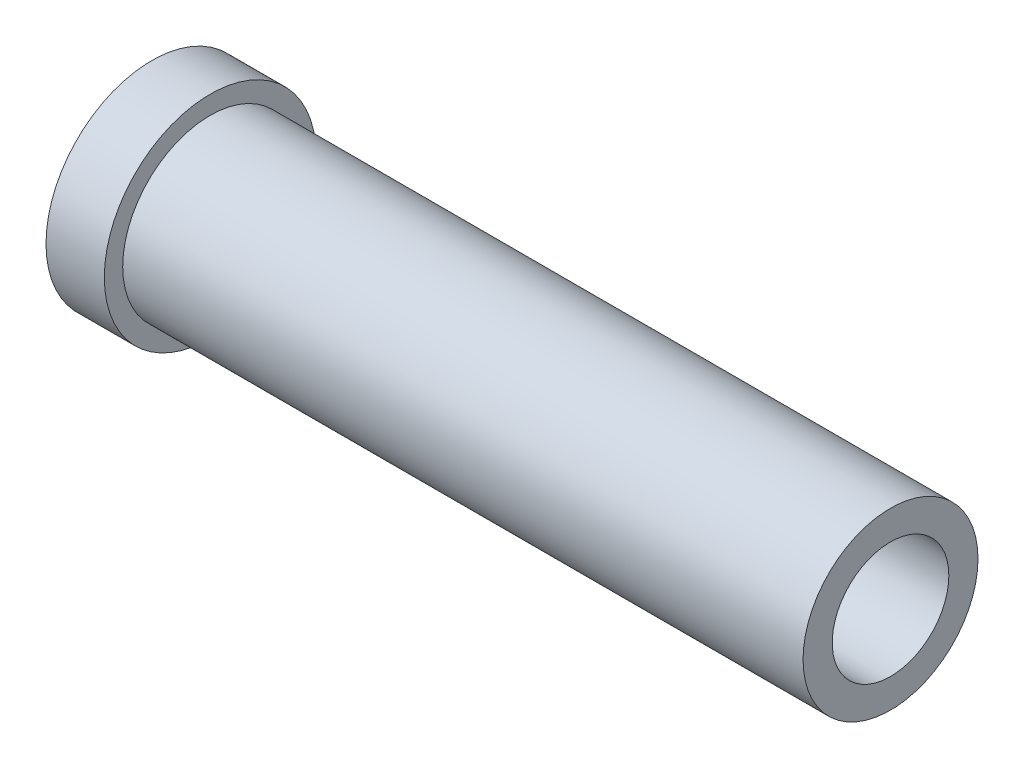
ISO-10303-21;
HEADER;
FILE_DESCRIPTION(('STEP AP214'),'2;1');
FILE_NAME('part.step','',(''),(''),'','','');
FILE_SCHEMA(('AUTOMOTIVE_DESIGN { 1 0 10303 214 1 1 1 1 }'));
ENDSEC;
DATA;
#1=APPLICATION_CONTEXT('core data for automotive mechanical design processes');
#2=APPLICATION_PROTOCOL_DEFINITION('international standard','automotive_design',2000,#1);
#3=PRODUCT_CONTEXT('',#1,'mechanical');
#4=PRODUCT('Part','Part','',(#3));
#5=PRODUCT_RELATED_PRODUCT_CATEGORY('part','',(#4));
#6=PRODUCT_DEFINITION_FORMATION('','',#4);
#7=PRODUCT_DEFINITION_CONTEXT('part definition',#1,'design');
#8=PRODUCT_DEFINITION('design','',#6,#7);
#9=PRODUCT_DEFINITION_SHAPE('','',#8);
#10=(LENGTH_UNIT() NAMED_UNIT(*) SI_UNIT(.MILLI.,.METRE.));
#11=(NAMED_UNIT(*) PLANE_ANGLE_UNIT() SI_UNIT($,.RADIAN.));
#12=(NAMED_UNIT(*) SI_UNIT($,.STERADIAN.) SOLID_ANGLE_UNIT());
#13=UNCERTAINTY_MEASURE_WITH_UNIT(LENGTH_MEASURE(1.E-05),#10,'distance_accuracy_value','');
#14=(GEOMETRIC_REPRESENTATION_CONTEXT(3) GLOBAL_UNCERTAINTY_ASSIGNED_CONTEXT((#13)) GLOBAL_UNIT_ASSIGNED_CONTEXT((#10,
#11,#12)) REPRESENTATION_CONTEXT('',''));
#15=CARTESIAN_POINT('',(0.,0.,0.));
#16=DIRECTION('',(0.,0.,1.));
#17=DIRECTION('',(1.,0.,0.));
#18=AXIS2_PLACEMENT_3D('',#15,#16,#17);
#19=CARTESIAN_POINT('',(38.,0.,0.));
#20=DIRECTION('',(-1.,0.,0.));
#21=DIRECTION('',(0.,0.,1.));
#22=AXIS2_PLACEMENT_3D('',#19,#20,#21);
#23=CYLINDRICAL_SURFACE('',#22,4.5);
#24=CARTESIAN_POINT('',(38.,0.,0.));
#25=DIRECTION('',(1.,0.,0.));
#26=DIRECTION('',(0.,0.,-1.));
#27=AXIS2_PLACEMENT_3D('',#24,#25,#26);
#28=CIRCLE('',#27,4.5);
#29=CARTESIAN_POINT('',(38.,0.,-4.5));
#30=VERTEX_POINT('',#29);
#31=EDGE_CURVE('E38',#30,#30,#28,.T.);
#32=ORIENTED_EDGE('',*,*,#31,.F.);
#33=EDGE_LOOP('',(#32));
#34=FACE_BOUND('',#33,.T.);
#35=CARTESIAN_POINT('',(3.,0.,0.));
#36=DIRECTION('',(-1.,0.,0.));
#37=DIRECTION('',(0.,0.,1.));
#38=AXIS2_PLACEMENT_3D('',#35,#36,#37);
#39=CIRCLE('',#38,4.5);
#40=CARTESIAN_POINT('',(3.,0.,4.5));
#41=VERTEX_POINT('',#40);
#42=EDGE_CURVE('E10',#41,#41,#39,.T.);
#43=ORIENTED_EDGE('',*,*,#42,.F.);
#44=EDGE_LOOP('',(#43));
#45=FACE_BOUND('',#44,.T.);
#46=ADVANCED_FACE('F32',(#34,#45),#23,.T.);
#47=CARTESIAN_POINT('',(38.,0.,0.));
#48=DIRECTION('',(1.,0.,0.));
#49=DIRECTION('',(0.,0.,-1.));
#50=AXIS2_PLACEMENT_3D('',#47,#48,#49);
#51=PLANE('',#50);
#52=ORIENTED_EDGE('',*,*,#31,.T.);
#53=EDGE_LOOP('',(#52));
#54=FACE_BOUND('',#53,.T.);
#55=CARTESIAN_POINT('',(38.,0.,0.));
#56=DIRECTION('',(1.,0.,0.));
#57=DIRECTION('',(0.,0.,-1.));
#58=AXIS2_PLACEMENT_3D('',#55,#56,#57);
#59=CIRCLE('',#58,3.);
#60=CARTESIAN_POINT('',(38.,0.,-3.));
#61=VERTEX_POINT('',#60);
#62=EDGE_CURVE('E42',#61,#61,#59,.T.);
#63=ORIENTED_EDGE('',*,*,#62,.F.);
#64=EDGE_LOOP('',(#63));
#65=FACE_BOUND('',#64,.T.);
#66=ADVANCED_FACE('F70',(#54,#65),#51,.T.);
#67=CARTESIAN_POINT('',(0.,0.,0.));
#68=DIRECTION('',(1.,0.,0.));
#69=DIRECTION('',(0.,0.,-1.));
#70=AXIS2_PLACEMENT_3D('',#67,#68,#69);
#71=PLANE('',#70);
#72=CARTESIAN_POINT('',(0.,0.,0.));
#73=DIRECTION('',(1.,0.,0.));
#74=DIRECTION('',(0.,0.,-1.));
#75=AXIS2_PLACEMENT_3D('',#72,#73,#74);
#76=CIRCLE('',#75,3.);
#77=CARTESIAN_POINT('',(0.,0.,-3.));
#78=VERTEX_POINT('',#77);
#79=EDGE_CURVE('E46',#78,#78,#76,.T.);
#80=ORIENTED_EDGE('',*,*,#79,.T.);
#81=EDGE_LOOP('',(#80));
#82=FACE_BOUND('',#81,.T.);
#83=CARTESIAN_POINT('',(0.,0.,0.));
#84=DIRECTION('',(-1.,0.,0.));
#85=DIRECTION('',(0.,0.,1.));
#86=AXIS2_PLACEMENT_3D('',#83,#84,#85);
#87=CIRCLE('',#86,5.44549810978367);
#88=CARTESIAN_POINT('',(0.,0.,5.44549810978367));
#89=VERTEX_POINT('',#88);
#90=EDGE_CURVE('E52',#89,#89,#87,.T.);
#91=ORIENTED_EDGE('',*,*,#90,.T.);
#92=EDGE_LOOP('',(#91));
#93=FACE_BOUND('',#92,.T.);
#94=ADVANCED_FACE('F75',(#82,#93),#71,.F.);
#95=CARTESIAN_POINT('',(38.,0.,0.));
#96=DIRECTION('',(-1.,0.,0.));
#97=DIRECTION('',(0.,0.,1.));
#98=AXIS2_PLACEMENT_3D('',#95,#96,#97);
#99=CYLINDRICAL_SURFACE('',#98,3.);
#100=ORIENTED_EDGE('',*,*,#62,.T.);
#101=EDGE_LOOP('',(#100));
#102=FACE_BOUND('',#101,.T.);
#103=ORIENTED_EDGE('',*,*,#79,.F.);
#104=EDGE_LOOP('',(#103));
#105=FACE_BOUND('',#104,.T.);
#106=ADVANCED_FACE('F67',(#102,#105),#99,.F.);
#107=CARTESIAN_POINT('',(3.,0.,0.));
#108=DIRECTION('',(-1.,0.,0.));
#109=DIRECTION('',(0.,0.,1.));
#110=AXIS2_PLACEMENT_3D('',#107,#108,#109);
#111=CYLINDRICAL_SURFACE('',#110,5.44549810978367);
#112=CARTESIAN_POINT('',(3.,0.,0.));
#113=DIRECTION('',(-1.,0.,0.));
#114=DIRECTION('',(0.,0.,1.));
#115=AXIS2_PLACEMENT_3D('',#112,#113,#114);
#116=CIRCLE('',#115,5.44549810978367);
#117=CARTESIAN_POINT('',(3.,0.,5.44549810978367));
#118=VERTEX_POINT('',#117);
#119=EDGE_CURVE('E50',#118,#118,#116,.T.);
#120=ORIENTED_EDGE('',*,*,#119,.T.);
#121=EDGE_LOOP('',(#120));
#122=FACE_BOUND('',#121,.T.);
#123=ORIENTED_EDGE('',*,*,#90,.F.);
#124=EDGE_LOOP('',(#123));
#125=FACE_BOUND('',#124,.T.);
#126=ADVANCED_FACE('F58',(#122,#125),#111,.T.);
#127=CARTESIAN_POINT('',(3.,0.,0.));
#128=DIRECTION('',(-1.,0.,0.));
#129=DIRECTION('',(0.,0.,1.));
#130=AXIS2_PLACEMENT_3D('',#127,#128,#129);
#131=PLANE('',#130);
#132=ORIENTED_EDGE('',*,*,#42,.T.);
#133=EDGE_LOOP('',(#132));
#134=FACE_BOUND('',#133,.T.);
#135=ORIENTED_EDGE('',*,*,#119,.F.);
#136=EDGE_LOOP('',(#135));
#137=FACE_BOUND('',#136,.T.);
#138=ADVANCED_FACE('F61',(#134,#137),#131,.F.);
#139=CLOSED_SHELL('',(#46,#66,#94,#106,#126,#138));
#140=MANIFOLD_SOLID_BREP('B2',#139);
#141=ADVANCED_BREP_SHAPE_REPRESENTATION('',(#18,#140),#14);
#142=SHAPE_DEFINITION_REPRESENTATION(#9,#141);
ENDSEC;
END-ISO-10303-21;
